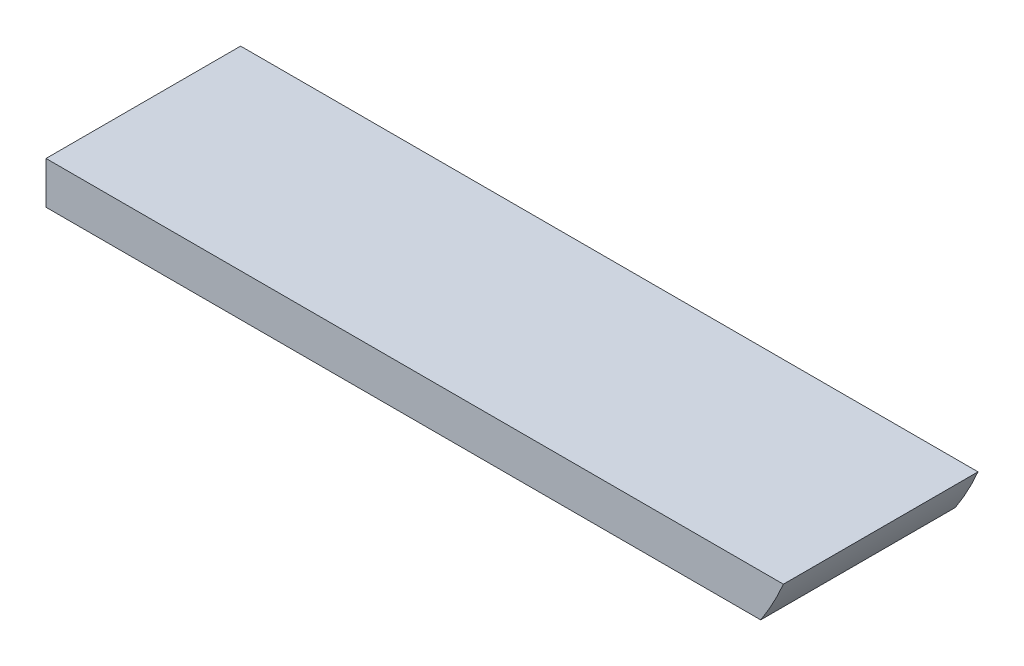
ISO-10303-21;
HEADER;
FILE_DESCRIPTION(('STEP AP214'),'2;1');
FILE_NAME('part.step','',(''),(''),'','','');
FILE_SCHEMA(('AUTOMOTIVE_DESIGN { 1 0 10303 214 1 1 1 1 }'));
ENDSEC;
DATA;
#1=APPLICATION_CONTEXT('core data for automotive mechanical design processes');
#2=APPLICATION_PROTOCOL_DEFINITION('international standard','automotive_design',2000,#1);
#3=PRODUCT_CONTEXT('',#1,'mechanical');
#4=PRODUCT('Part','Part','',(#3));
#5=PRODUCT_RELATED_PRODUCT_CATEGORY('part','',(#4));
#6=PRODUCT_DEFINITION_FORMATION('','',#4);
#7=PRODUCT_DEFINITION_CONTEXT('part definition',#1,'design');
#8=PRODUCT_DEFINITION('design','',#6,#7);
#9=PRODUCT_DEFINITION_SHAPE('','',#8);
#10=(LENGTH_UNIT() NAMED_UNIT(*) SI_UNIT(.MILLI.,.METRE.));
#11=(NAMED_UNIT(*) PLANE_ANGLE_UNIT() SI_UNIT($,.RADIAN.));
#12=(NAMED_UNIT(*) SI_UNIT($,.STERADIAN.) SOLID_ANGLE_UNIT());
#13=UNCERTAINTY_MEASURE_WITH_UNIT(LENGTH_MEASURE(1.E-05),#10,'distance_accuracy_value','');
#14=(GEOMETRIC_REPRESENTATION_CONTEXT(3) GLOBAL_UNCERTAINTY_ASSIGNED_CONTEXT((#13)) GLOBAL_UNIT_ASSIGNED_CONTEXT((#10,
#11,#12)) REPRESENTATION_CONTEXT('',''));
#15=CARTESIAN_POINT('',(0.,0.,0.));
#16=DIRECTION('',(0.,0.,1.));
#17=DIRECTION('',(1.,0.,0.));
#18=AXIS2_PLACEMENT_3D('',#15,#16,#17);
#19=CARTESIAN_POINT('',(-27.120912466168,5.934316226117,0.));
#20=DIRECTION('',(0.,-1.,0.));
#21=DIRECTION('',(1.,0.,0.));
#22=AXIS2_PLACEMENT_3D('',#19,#20,#21);
#23=PLANE('',#22);
#24=DIRECTION('',(1.,0.,0.));
#25=VECTOR('',#24,1.);
#26=CARTESIAN_POINT('',(-27.120912466168,5.934316226117,0.));
#27=LINE('',#26,#25);
#28=CARTESIAN_POINT('',(-27.120912466168,5.934316226117,0.));
#29=VERTEX_POINT('',#28);
#30=CARTESIAN_POINT('',(-26.753649788755,5.934316226117,0.));
#31=VERTEX_POINT('',#30);
#32=EDGE_CURVE('E11',#29,#31,#27,.T.);
#33=ORIENTED_EDGE('',*,*,#32,.T.);
#34=DIRECTION('',(0.,0.,1.));
#35=VECTOR('',#34,1.);
#36=CARTESIAN_POINT('',(-26.753649788755,5.934316226117,0.));
#37=LINE('',#36,#35);
#38=CARTESIAN_POINT('',(-26.753649788755,5.934316226117,0.1));
#39=VERTEX_POINT('',#38);
#40=EDGE_CURVE('E24',#31,#39,#37,.T.);
#41=ORIENTED_EDGE('',*,*,#40,.T.);
#42=DIRECTION('',(1.,0.,0.));
#43=VECTOR('',#42,1.);
#44=CARTESIAN_POINT('',(-27.120912466168,5.934316226117,0.1));
#45=LINE('',#44,#43);
#46=CARTESIAN_POINT('',(-27.120912466168,5.934316226117,0.1));
#47=VERTEX_POINT('',#46);
#48=EDGE_CURVE('E75',#47,#39,#45,.T.);
#49=ORIENTED_EDGE('',*,*,#48,.F.);
#50=DIRECTION('',(0.,0.,1.));
#51=VECTOR('',#50,1.);
#52=CARTESIAN_POINT('',(-27.120912466168,5.934316226117,0.));
#53=LINE('',#52,#51);
#54=EDGE_CURVE('E86',#29,#47,#53,.T.);
#55=ORIENTED_EDGE('',*,*,#54,.F.);
#56=EDGE_LOOP('',(#33,#41,#49,#55));
#57=FACE_BOUND('',#56,.T.);
#58=ADVANCED_FACE('F17',(#57),#23,.T.);
#59=CARTESIAN_POINT('',(-27.120912466168,5.956045362914,0.));
#60=DIRECTION('',(-1.,0.,0.));
#61=DIRECTION('',(0.,-1.,0.));
#62=AXIS2_PLACEMENT_3D('',#59,#60,#61);
#63=PLANE('',#62);
#64=DIRECTION('',(0.,-1.,0.));
#65=VECTOR('',#64,1.);
#66=CARTESIAN_POINT('',(-27.120912466168,5.956045362914,0.));
#67=LINE('',#66,#65);
#68=CARTESIAN_POINT('',(-27.120912466168,5.956045362914,0.));
#69=VERTEX_POINT('',#68);
#70=EDGE_CURVE('E83',#69,#29,#67,.T.);
#71=ORIENTED_EDGE('',*,*,#70,.T.);
#72=ORIENTED_EDGE('',*,*,#54,.T.);
#73=DIRECTION('',(0.,-1.,0.));
#74=VECTOR('',#73,1.);
#75=CARTESIAN_POINT('',(-27.120912466168,5.956045362914,0.1));
#76=LINE('',#75,#74);
#77=CARTESIAN_POINT('',(-27.120912466168,5.956045362914,0.1));
#78=VERTEX_POINT('',#77);
#79=EDGE_CURVE('E81',#78,#47,#76,.T.);
#80=ORIENTED_EDGE('',*,*,#79,.F.);
#81=DIRECTION('',(0.,0.,1.));
#82=VECTOR('',#81,1.);
#83=CARTESIAN_POINT('',(-27.120912466168,5.956045362914,0.));
#84=LINE('',#83,#82);
#85=EDGE_CURVE('E61',#69,#78,#84,.T.);
#86=ORIENTED_EDGE('',*,*,#85,.F.);
#87=EDGE_LOOP('',(#71,#72,#80,#86));
#88=FACE_BOUND('',#87,.T.);
#89=ADVANCED_FACE('F91',(#88),#63,.T.);
#90=CARTESIAN_POINT('',(-26.741992469641,5.956045362914,0.));
#91=DIRECTION('',(0.,1.,0.));
#92=DIRECTION('',(-1.,0.,0.));
#93=AXIS2_PLACEMENT_3D('',#90,#91,#92);
#94=PLANE('',#93);
#95=DIRECTION('',(-1.,0.,0.));
#96=VECTOR('',#95,1.);
#97=CARTESIAN_POINT('',(-26.741992469641,5.956045362914,0.));
#98=LINE('',#97,#96);
#99=CARTESIAN_POINT('',(-26.741992469641,5.956045362914,0.));
#100=VERTEX_POINT('',#99);
#101=EDGE_CURVE('E65',#100,#69,#98,.T.);
#102=ORIENTED_EDGE('',*,*,#101,.T.);
#103=ORIENTED_EDGE('',*,*,#85,.T.);
#104=DIRECTION('',(-1.,0.,0.));
#105=VECTOR('',#104,1.);
#106=CARTESIAN_POINT('',(-26.741992469641,5.956045362914,0.1));
#107=LINE('',#106,#105);
#108=CARTESIAN_POINT('',(-26.741992469641,5.956045362914,0.1));
#109=VERTEX_POINT('',#108);
#110=EDGE_CURVE('E54',#109,#78,#107,.T.);
#111=ORIENTED_EDGE('',*,*,#110,.F.);
#112=DIRECTION('',(0.,0.,1.));
#113=VECTOR('',#112,1.);
#114=CARTESIAN_POINT('',(-26.741992469641,5.956045362914,0.));
#115=LINE('',#114,#113);
#116=EDGE_CURVE('E58',#100,#109,#115,.T.);
#117=ORIENTED_EDGE('',*,*,#116,.F.);
#118=EDGE_LOOP('',(#102,#103,#111,#117));
#119=FACE_BOUND('',#118,.T.);
#120=ADVANCED_FACE('F57',(#119),#94,.T.);
#121=CARTESIAN_POINT('',(-26.871812170946,6.011699918327,0.));
#122=DIRECTION('',(0.,0.,1.));
#123=DIRECTION('',(0.836568344934582,-0.547862577891039,0.));
#124=AXIS2_PLACEMENT_3D('',#121,#122,#123);
#125=CYLINDRICAL_SURFACE('',#124,0.14124653760403);
#126=CARTESIAN_POINT('',(-26.871812170946,6.011699918327,0.));
#127=DIRECTION('',(0.,0.,1.));
#128=DIRECTION('',(0.836568344934582,-0.547862577891039,0.));
#129=AXIS2_PLACEMENT_3D('',#126,#127,#128);
#130=CIRCLE('',#129,0.14124653760403);
#131=EDGE_CURVE('E71',#31,#100,#130,.T.);
#132=ORIENTED_EDGE('',*,*,#131,.T.);
#133=ORIENTED_EDGE('',*,*,#116,.T.);
#134=CARTESIAN_POINT('',(-26.871812170946,6.011699918327,0.1));
#135=DIRECTION('',(0.,0.,1.));
#136=DIRECTION('',(0.836568344934582,-0.547862577891039,0.));
#137=AXIS2_PLACEMENT_3D('',#134,#135,#136);
#138=CIRCLE('',#137,0.14124653760403);
#139=EDGE_CURVE('E70',#39,#109,#138,.T.);
#140=ORIENTED_EDGE('',*,*,#139,.F.);
#141=ORIENTED_EDGE('',*,*,#40,.F.);
#142=EDGE_LOOP('',(#132,#133,#140,#141));
#143=FACE_BOUND('',#142,.T.);
#144=ADVANCED_FACE('F69',(#143),#125,.T.);
#145=CARTESIAN_POINT('',(-26.935077949812,5.94533784064,0.1));
#146=DIRECTION('',(0.,0.,1.));
#147=DIRECTION('',(1.,0.,0.));
#148=AXIS2_PLACEMENT_3D('',#145,#146,#147);
#149=PLANE('',#148);
#150=ORIENTED_EDGE('',*,*,#139,.T.);
#151=ORIENTED_EDGE('',*,*,#110,.T.);
#152=ORIENTED_EDGE('',*,*,#79,.T.);
#153=ORIENTED_EDGE('',*,*,#48,.T.);
#154=EDGE_LOOP('',(#150,#151,#152,#153));
#155=FACE_BOUND('',#154,.T.);
#156=ADVANCED_FACE('F74',(#155),#149,.T.);
#157=CARTESIAN_POINT('',(-26.935077949812,5.94533784064,0.));
#158=DIRECTION('',(0.,0.,1.));
#159=DIRECTION('',(1.,0.,0.));
#160=AXIS2_PLACEMENT_3D('',#157,#158,#159);
#161=PLANE('',#160);
#162=ORIENTED_EDGE('',*,*,#131,.F.);
#163=ORIENTED_EDGE('',*,*,#32,.F.);
#164=ORIENTED_EDGE('',*,*,#70,.F.);
#165=ORIENTED_EDGE('',*,*,#101,.F.);
#166=EDGE_LOOP('',(#162,#163,#164,#165));
#167=FACE_BOUND('',#166,.T.);
#168=ADVANCED_FACE('F89',(#167),#161,.F.);
#169=CLOSED_SHELL('',(#58,#89,#120,#144,#156,#168));
#170=MANIFOLD_SOLID_BREP('B1',#169);
#171=ADVANCED_BREP_SHAPE_REPRESENTATION('',(#18,#170),#14);
#172=SHAPE_DEFINITION_REPRESENTATION(#9,#171);
ENDSEC;
END-ISO-10303-21;
